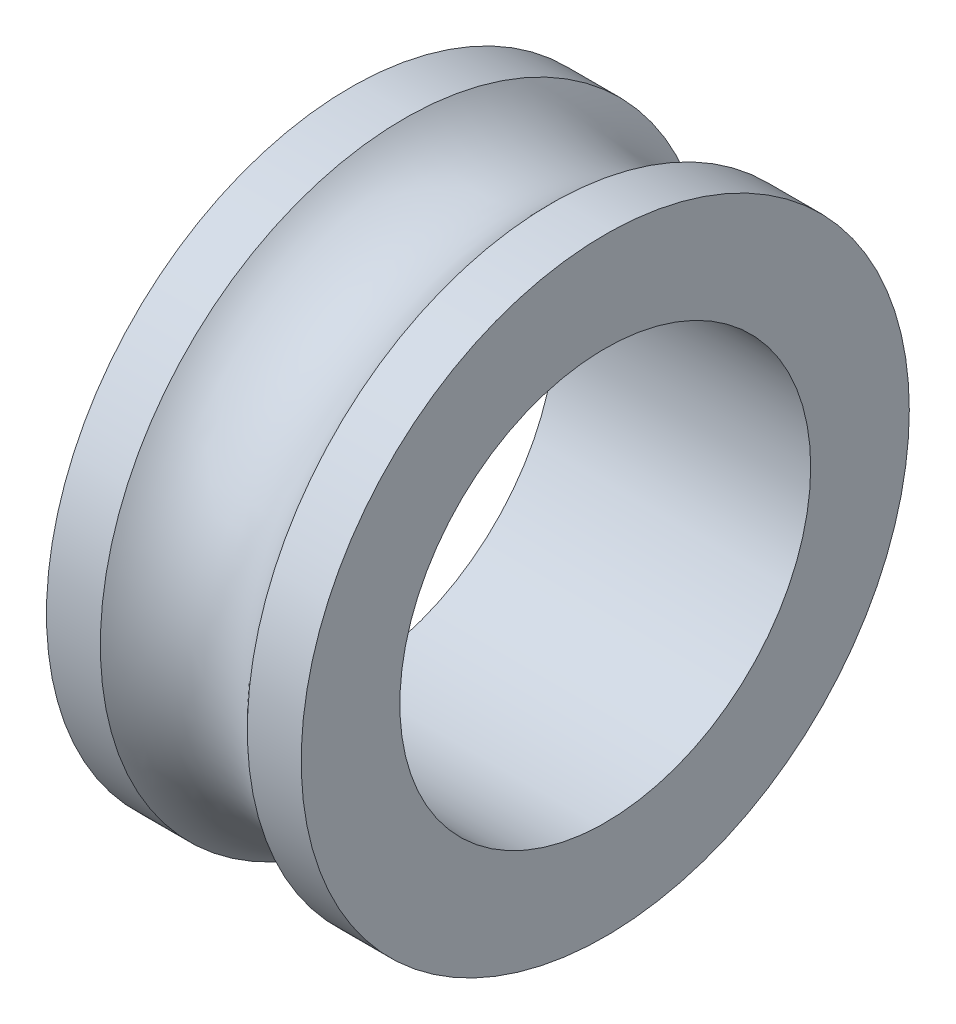
ISO-10303-21;
HEADER;
FILE_DESCRIPTION(('STEP AP214'),'2;1');
FILE_NAME('part.step','',(''),(''),'','','');
FILE_SCHEMA(('AUTOMOTIVE_DESIGN { 1 0 10303 214 1 1 1 1 }'));
ENDSEC;
DATA;
#1=APPLICATION_CONTEXT('core data for automotive mechanical design processes');
#2=APPLICATION_PROTOCOL_DEFINITION('international standard','automotive_design',2000,#1);
#3=PRODUCT_CONTEXT('',#1,'mechanical');
#4=PRODUCT('Part','Part','',(#3));
#5=PRODUCT_RELATED_PRODUCT_CATEGORY('part','',(#4));
#6=PRODUCT_DEFINITION_FORMATION('','',#4);
#7=PRODUCT_DEFINITION_CONTEXT('part definition',#1,'design');
#8=PRODUCT_DEFINITION('design','',#6,#7);
#9=PRODUCT_DEFINITION_SHAPE('','',#8);
#10=(LENGTH_UNIT() NAMED_UNIT(*) SI_UNIT(.MILLI.,.METRE.));
#11=(NAMED_UNIT(*) PLANE_ANGLE_UNIT() SI_UNIT($,.RADIAN.));
#12=(NAMED_UNIT(*) SI_UNIT($,.STERADIAN.) SOLID_ANGLE_UNIT());
#13=UNCERTAINTY_MEASURE_WITH_UNIT(LENGTH_MEASURE(1.E-05),#10,'distance_accuracy_value','');
#14=(GEOMETRIC_REPRESENTATION_CONTEXT(3) GLOBAL_UNCERTAINTY_ASSIGNED_CONTEXT((#13)) GLOBAL_UNIT_ASSIGNED_CONTEXT((#10,
#11,#12)) REPRESENTATION_CONTEXT('',''));
#15=CARTESIAN_POINT('',(0.,0.,0.));
#16=DIRECTION('',(0.,0.,1.));
#17=DIRECTION('',(1.,0.,0.));
#18=AXIS2_PLACEMENT_3D('',#15,#16,#17);
#19=CARTESIAN_POINT('',(49.7889182058048,0.,0.));
#20=DIRECTION('',(1.,0.,0.));
#21=DIRECTION('',(0.,0.,-1.));
#22=AXIS2_PLACEMENT_3D('',#19,#20,#21);
#23=CYLINDRICAL_SURFACE('',#22,37.);
#24=CARTESIAN_POINT('',(-15.5,0.,0.));
#25=DIRECTION('',(1.,0.,0.));
#26=DIRECTION('',(0.,0.,-1.));
#27=AXIS2_PLACEMENT_3D('',#24,#25,#26);
#28=CIRCLE('',#27,37.);
#29=CARTESIAN_POINT('',(-15.5,0.,-37.));
#30=VERTEX_POINT('',#29);
#31=EDGE_CURVE('E10',#30,#30,#28,.T.);
#32=ORIENTED_EDGE('',*,*,#31,.T.);
#33=EDGE_LOOP('',(#32));
#34=FACE_BOUND('',#33,.T.);
#35=CARTESIAN_POINT('',(-8.94427190999916,0.,0.));
#36=DIRECTION('',(1.,0.,0.));
#37=DIRECTION('',(0.,0.,-1.));
#38=AXIS2_PLACEMENT_3D('',#35,#36,#37);
#39=CIRCLE('',#38,37.);
#40=CARTESIAN_POINT('',(-8.94427190999916,0.,-37.));
#41=VERTEX_POINT('',#40);
#42=EDGE_CURVE('E64',#41,#41,#39,.T.);
#43=ORIENTED_EDGE('',*,*,#42,.F.);
#44=EDGE_LOOP('',(#43));
#45=FACE_BOUND('',#44,.T.);
#46=ADVANCED_FACE('F37',(#34,#45),#23,.T.);
#47=CARTESIAN_POINT('',(-15.5,37.,0.));
#48=DIRECTION('',(-1.,0.,0.));
#49=DIRECTION('',(0.,0.,1.));
#50=AXIS2_PLACEMENT_3D('',#47,#48,#49);
#51=PLANE('',#50);
#52=CARTESIAN_POINT('',(-15.5,0.,0.));
#53=DIRECTION('',(1.,0.,0.));
#54=DIRECTION('',(0.,0.,-1.));
#55=AXIS2_PLACEMENT_3D('',#52,#53,#54);
#56=CIRCLE('',#55,25.);
#57=CARTESIAN_POINT('',(-15.5,0.,-25.));
#58=VERTEX_POINT('',#57);
#59=EDGE_CURVE('E44',#58,#58,#56,.T.);
#60=ORIENTED_EDGE('',*,*,#59,.T.);
#61=EDGE_LOOP('',(#60));
#62=FACE_BOUND('',#61,.T.);
#63=ORIENTED_EDGE('',*,*,#31,.F.);
#64=EDGE_LOOP('',(#63));
#65=FACE_BOUND('',#64,.T.);
#66=ADVANCED_FACE('F72',(#62,#65),#51,.T.);
#67=CARTESIAN_POINT('',(49.7889182058048,0.,0.));
#68=DIRECTION('',(1.,0.,0.));
#69=DIRECTION('',(0.,0.,-1.));
#70=AXIS2_PLACEMENT_3D('',#67,#68,#69);
#71=CYLINDRICAL_SURFACE('',#70,25.);
#72=ORIENTED_EDGE('',*,*,#59,.F.);
#73=EDGE_LOOP('',(#72));
#74=FACE_BOUND('',#73,.T.);
#75=CARTESIAN_POINT('',(15.5,0.,0.));
#76=DIRECTION('',(1.,0.,0.));
#77=DIRECTION('',(0.,0.,-1.));
#78=AXIS2_PLACEMENT_3D('',#75,#76,#77);
#79=CIRCLE('',#78,25.);
#80=CARTESIAN_POINT('',(15.5,0.,-25.));
#81=VERTEX_POINT('',#80);
#82=EDGE_CURVE('E49',#81,#81,#79,.T.);
#83=ORIENTED_EDGE('',*,*,#82,.T.);
#84=EDGE_LOOP('',(#83));
#85=FACE_BOUND('',#84,.T.);
#86=ADVANCED_FACE('F76',(#74,#85),#71,.F.);
#87=CARTESIAN_POINT('',(15.5,37.,0.));
#88=DIRECTION('',(-1.,0.,0.));
#89=DIRECTION('',(0.,0.,1.));
#90=AXIS2_PLACEMENT_3D('',#87,#88,#89);
#91=PLANE('',#90);
#92=ORIENTED_EDGE('',*,*,#82,.F.);
#93=EDGE_LOOP('',(#92));
#94=FACE_BOUND('',#93,.T.);
#95=CARTESIAN_POINT('',(15.5,0.,0.));
#96=DIRECTION('',(1.,0.,0.));
#97=DIRECTION('',(0.,0.,-1.));
#98=AXIS2_PLACEMENT_3D('',#95,#96,#97);
#99=CIRCLE('',#98,37.);
#100=CARTESIAN_POINT('',(15.5,0.,-37.));
#101=VERTEX_POINT('',#100);
#102=EDGE_CURVE('E54',#101,#101,#99,.T.);
#103=ORIENTED_EDGE('',*,*,#102,.T.);
#104=EDGE_LOOP('',(#103));
#105=FACE_BOUND('',#104,.T.);
#106=ADVANCED_FACE('F80',(#94,#105),#91,.F.);
#107=CARTESIAN_POINT('',(49.7889182058048,0.,0.));
#108=DIRECTION('',(1.,0.,0.));
#109=DIRECTION('',(0.,0.,-1.));
#110=AXIS2_PLACEMENT_3D('',#107,#108,#109);
#111=CYLINDRICAL_SURFACE('',#110,37.);
#112=CARTESIAN_POINT('',(8.94427190999916,0.,0.));
#113=DIRECTION('',(1.,0.,0.));
#114=DIRECTION('',(0.,0.,-1.));
#115=AXIS2_PLACEMENT_3D('',#112,#113,#114);
#116=CIRCLE('',#115,37.);
#117=CARTESIAN_POINT('',(8.94427190999916,0.,-37.));
#118=VERTEX_POINT('',#117);
#119=EDGE_CURVE('E60',#118,#118,#116,.T.);
#120=ORIENTED_EDGE('',*,*,#119,.T.);
#121=EDGE_LOOP('',(#120));
#122=FACE_BOUND('',#121,.T.);
#123=ORIENTED_EDGE('',*,*,#102,.F.);
#124=EDGE_LOOP('',(#123));
#125=FACE_BOUND('',#124,.T.);
#126=ADVANCED_FACE('F87',(#122,#125),#111,.T.);
#127=CARTESIAN_POINT('',(0.,0.,0.));
#128=DIRECTION('',(1.,0.,0.));
#129=DIRECTION('',(0.,0.,-1.));
#130=AXIS2_PLACEMENT_3D('',#127,#128,#129);
#131=TOROIDAL_SURFACE('',#130,45.,12.);
#132=ORIENTED_EDGE('',*,*,#119,.F.);
#133=EDGE_LOOP('',(#132));
#134=FACE_BOUND('',#133,.T.);
#135=ORIENTED_EDGE('',*,*,#42,.T.);
#136=EDGE_LOOP('',(#135));
#137=FACE_BOUND('',#136,.T.);
#138=ADVANCED_FACE('F69',(#134,#137),#131,.F.);
#139=CLOSED_SHELL('',(#46,#66,#86,#106,#126,#138));
#140=MANIFOLD_SOLID_BREP('B2',#139);
#141=ADVANCED_BREP_SHAPE_REPRESENTATION('',(#18,#140),#14);
#142=SHAPE_DEFINITION_REPRESENTATION(#9,#141);
ENDSEC;
END-ISO-10303-21;
